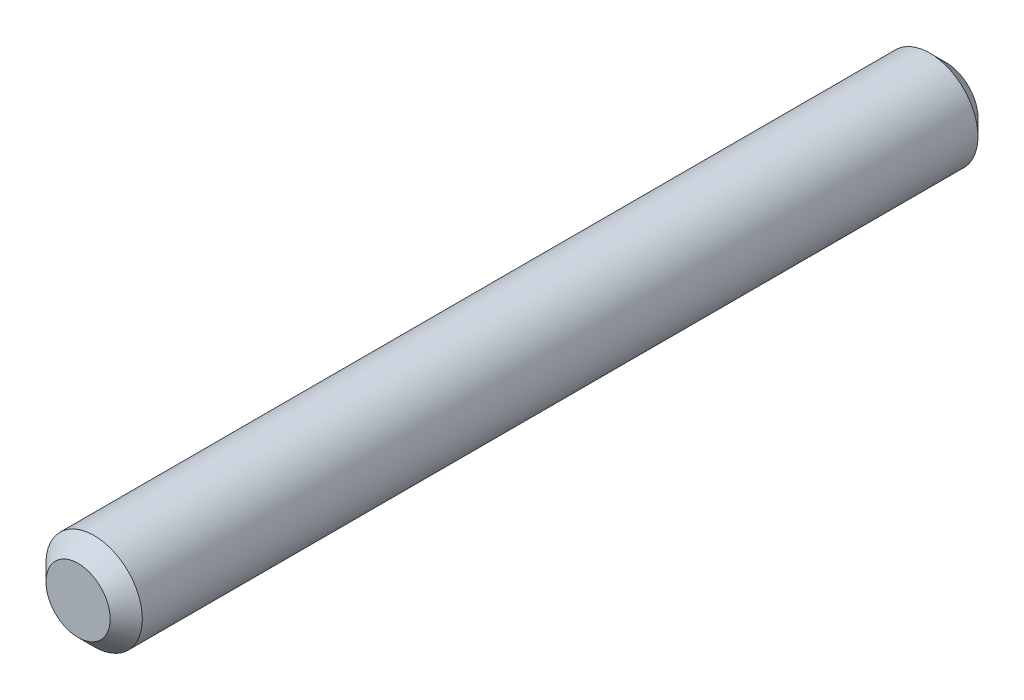
ISO-10303-21;
HEADER;
FILE_DESCRIPTION(('STEP AP214'),'2;1');
FILE_NAME('part.step','',(''),(''),'','','');
FILE_SCHEMA(('AUTOMOTIVE_DESIGN { 1 0 10303 214 1 1 1 1 }'));
ENDSEC;
DATA;
#1=APPLICATION_CONTEXT('core data for automotive mechanical design processes');
#2=APPLICATION_PROTOCOL_DEFINITION('international standard','automotive_design',2000,#1);
#3=PRODUCT_CONTEXT('',#1,'mechanical');
#4=PRODUCT('Part','Part','',(#3));
#5=PRODUCT_RELATED_PRODUCT_CATEGORY('part','',(#4));
#6=PRODUCT_DEFINITION_FORMATION('','',#4);
#7=PRODUCT_DEFINITION_CONTEXT('part definition',#1,'design');
#8=PRODUCT_DEFINITION('design','',#6,#7);
#9=PRODUCT_DEFINITION_SHAPE('','',#8);
#10=(LENGTH_UNIT() NAMED_UNIT(*) SI_UNIT(.MILLI.,.METRE.));
#11=(NAMED_UNIT(*) PLANE_ANGLE_UNIT() SI_UNIT($,.RADIAN.));
#12=(NAMED_UNIT(*) SI_UNIT($,.STERADIAN.) SOLID_ANGLE_UNIT());
#13=UNCERTAINTY_MEASURE_WITH_UNIT(LENGTH_MEASURE(1.E-05),#10,'distance_accuracy_value','');
#14=(GEOMETRIC_REPRESENTATION_CONTEXT(3) GLOBAL_UNCERTAINTY_ASSIGNED_CONTEXT((#13)) GLOBAL_UNIT_ASSIGNED_CONTEXT((#10,
#11,#12)) REPRESENTATION_CONTEXT('',''));
#15=CARTESIAN_POINT('',(0.,0.,0.));
#16=DIRECTION('',(0.,0.,1.));
#17=DIRECTION('',(1.,0.,0.));
#18=AXIS2_PLACEMENT_3D('',#15,#16,#17);
#19=CARTESIAN_POINT('',(0.,0.,54.));
#20=DIRECTION('',(0.,0.,-1.));
#21=DIRECTION('',(-1.,0.,0.));
#22=AXIS2_PLACEMENT_3D('',#19,#20,#21);
#23=CYLINDRICAL_SURFACE('',#22,3.);
#24=CARTESIAN_POINT('',(0.,0.,1.00000000000001));
#25=DIRECTION('',(0.,0.,1.));
#26=DIRECTION('',(1.,0.,0.));
#27=AXIS2_PLACEMENT_3D('',#24,#25,#26);
#28=CIRCLE('',#27,3.);
#29=CARTESIAN_POINT('',(3.,0.,1.00000000000001));
#30=VERTEX_POINT('',#29);
#31=EDGE_CURVE('E50',#30,#30,#28,.T.);
#32=ORIENTED_EDGE('',*,*,#31,.T.);
#33=EDGE_LOOP('',(#32));
#34=FACE_BOUND('',#33,.T.);
#35=CARTESIAN_POINT('',(0.,0.,53.));
#36=DIRECTION('',(0.,0.,1.));
#37=DIRECTION('',(1.,0.,0.));
#38=AXIS2_PLACEMENT_3D('',#35,#36,#37);
#39=CIRCLE('',#38,3.);
#40=CARTESIAN_POINT('',(3.,0.,53.));
#41=VERTEX_POINT('',#40);
#42=EDGE_CURVE('E55',#41,#41,#39,.F.);
#43=ORIENTED_EDGE('',*,*,#42,.T.);
#44=EDGE_LOOP('',(#43));
#45=FACE_BOUND('',#44,.T.);
#46=ADVANCED_FACE('F37',(#34,#45),#23,.T.);
#47=CARTESIAN_POINT('',(0.,0.,54.));
#48=DIRECTION('',(0.,0.,1.));
#49=DIRECTION('',(1.,0.,0.));
#50=AXIS2_PLACEMENT_3D('',#47,#48,#49);
#51=PLANE('',#50);
#52=CARTESIAN_POINT('',(0.,0.,54.));
#53=DIRECTION('',(0.,0.,1.));
#54=DIRECTION('',(1.,0.,0.));
#55=AXIS2_PLACEMENT_3D('',#52,#53,#54);
#56=CIRCLE('',#55,2.);
#57=CARTESIAN_POINT('',(2.,0.,54.));
#58=VERTEX_POINT('',#57);
#59=EDGE_CURVE('E10',#58,#58,#56,.T.);
#60=ORIENTED_EDGE('',*,*,#59,.T.);
#61=EDGE_LOOP('',(#60));
#62=FACE_BOUND('',#61,.T.);
#63=ADVANCED_FACE('F72',(#62),#51,.T.);
#64=CARTESIAN_POINT('',(0.,0.,0.));
#65=DIRECTION('',(0.,0.,1.));
#66=DIRECTION('',(1.,0.,0.));
#67=AXIS2_PLACEMENT_3D('',#64,#65,#66);
#68=PLANE('',#67);
#69=CARTESIAN_POINT('',(0.,0.,0.));
#70=DIRECTION('',(0.,0.,1.));
#71=DIRECTION('',(1.,0.,0.));
#72=AXIS2_PLACEMENT_3D('',#69,#70,#71);
#73=CIRCLE('',#72,1.99999999999999);
#74=CARTESIAN_POINT('',(1.99999999999999,0.,0.));
#75=VERTEX_POINT('',#74);
#76=EDGE_CURVE('E45',#75,#75,#73,.F.);
#77=ORIENTED_EDGE('',*,*,#76,.T.);
#78=EDGE_LOOP('',(#77));
#79=FACE_BOUND('',#78,.T.);
#80=ADVANCED_FACE('F69',(#79),#68,.F.);
#81=CARTESIAN_POINT('',(0.,0.,1.00000000000001));
#82=DIRECTION('',(0.,0.,1.));
#83=DIRECTION('',(1.,0.,0.));
#84=AXIS2_PLACEMENT_3D('',#81,#82,#83);
#85=CONICAL_SURFACE('',#84,3.,0.78539816339745);
#86=ORIENTED_EDGE('',*,*,#76,.F.);
#87=EDGE_LOOP('',(#86));
#88=FACE_BOUND('',#87,.T.);
#89=ORIENTED_EDGE('',*,*,#31,.F.);
#90=EDGE_LOOP('',(#89));
#91=FACE_BOUND('',#90,.T.);
#92=ADVANCED_FACE('F65',(#88,#91),#85,.T.);
#93=CARTESIAN_POINT('',(0.,0.,54.));
#94=DIRECTION('',(0.,0.,-1.));
#95=DIRECTION('',(-1.,0.,0.));
#96=AXIS2_PLACEMENT_3D('',#93,#94,#95);
#97=CONICAL_SURFACE('',#96,2.,0.785398163397447);
#98=ORIENTED_EDGE('',*,*,#42,.F.);
#99=EDGE_LOOP('',(#98));
#100=FACE_BOUND('',#99,.T.);
#101=ORIENTED_EDGE('',*,*,#59,.F.);
#102=EDGE_LOOP('',(#101));
#103=FACE_BOUND('',#102,.T.);
#104=ADVANCED_FACE('F39',(#100,#103),#97,.T.);
#105=CLOSED_SHELL('',(#46,#63,#80,#92,#104));
#106=MANIFOLD_SOLID_BREP('B2',#105);
#107=ADVANCED_BREP_SHAPE_REPRESENTATION('',(#18,#106),#14);
#108=SHAPE_DEFINITION_REPRESENTATION(#9,#107);
ENDSEC;
END-ISO-10303-21;
